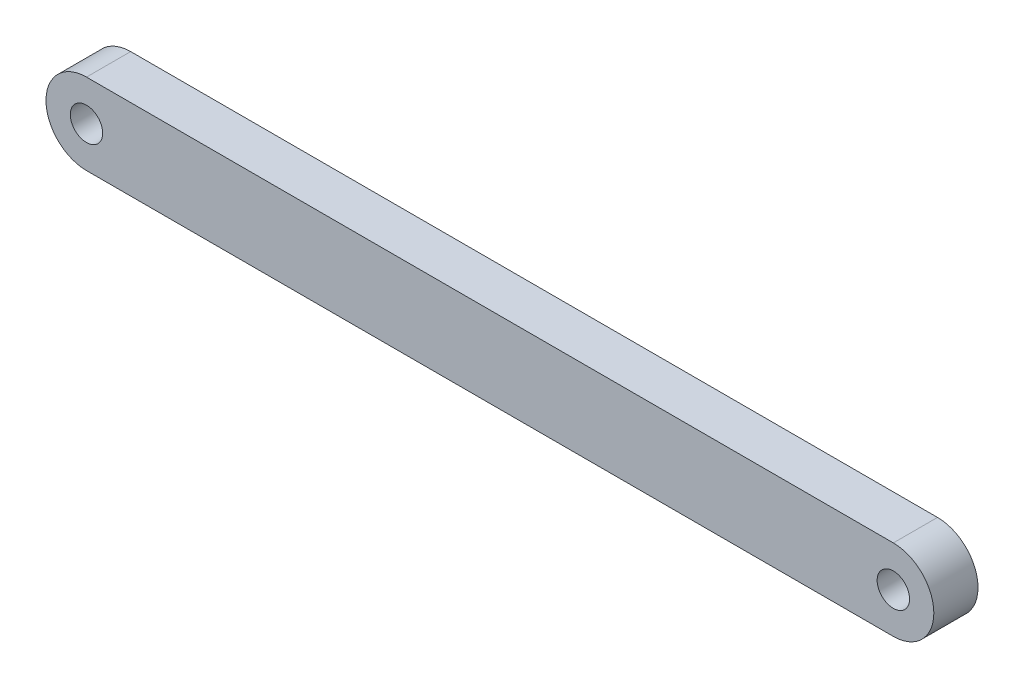
ISO-10303-21;
HEADER;
FILE_DESCRIPTION(('STEP AP214'),'2;1');
FILE_NAME('part.step','',(''),(''),'','','');
FILE_SCHEMA(('AUTOMOTIVE_DESIGN { 1 0 10303 214 1 1 1 1 }'));
ENDSEC;
DATA;
#1=APPLICATION_CONTEXT('core data for automotive mechanical design processes');
#2=APPLICATION_PROTOCOL_DEFINITION('international standard','automotive_design',2000,#1);
#3=PRODUCT_CONTEXT('',#1,'mechanical');
#4=PRODUCT('Part','Part','',(#3));
#5=PRODUCT_RELATED_PRODUCT_CATEGORY('part','',(#4));
#6=PRODUCT_DEFINITION_FORMATION('','',#4);
#7=PRODUCT_DEFINITION_CONTEXT('part definition',#1,'design');
#8=PRODUCT_DEFINITION('design','',#6,#7);
#9=PRODUCT_DEFINITION_SHAPE('','',#8);
#10=(LENGTH_UNIT() NAMED_UNIT(*) SI_UNIT(.MILLI.,.METRE.));
#11=(NAMED_UNIT(*) PLANE_ANGLE_UNIT() SI_UNIT($,.RADIAN.));
#12=(NAMED_UNIT(*) SI_UNIT($,.STERADIAN.) SOLID_ANGLE_UNIT());
#13=UNCERTAINTY_MEASURE_WITH_UNIT(LENGTH_MEASURE(1.E-05),#10,'distance_accuracy_value','');
#14=(GEOMETRIC_REPRESENTATION_CONTEXT(3) GLOBAL_UNCERTAINTY_ASSIGNED_CONTEXT((#13)) GLOBAL_UNIT_ASSIGNED_CONTEXT((#10,
#11,#12)) REPRESENTATION_CONTEXT('',''));
#15=CARTESIAN_POINT('',(0.,0.,0.));
#16=DIRECTION('',(0.,0.,1.));
#17=DIRECTION('',(1.,0.,0.));
#18=AXIS2_PLACEMENT_3D('',#15,#16,#17);
#19=CARTESIAN_POINT('',(-10.9893325627139,0.,3.));
#20=DIRECTION('',(0.,0.,-1.));
#21=DIRECTION('',(-1.,0.,0.));
#22=AXIS2_PLACEMENT_3D('',#19,#20,#21);
#23=CYLINDRICAL_SURFACE('',#22,2.75);
#24=CARTESIAN_POINT('',(-10.9893325627139,0.,0.));
#25=DIRECTION('',(0.,0.,1.));
#26=DIRECTION('',(1.,0.,0.));
#27=AXIS2_PLACEMENT_3D('',#24,#25,#26);
#28=CIRCLE('',#27,2.75);
#29=CARTESIAN_POINT('',(-10.9893325627139,2.75,0.));
#30=VERTEX_POINT('',#29);
#31=CARTESIAN_POINT('',(-10.9893325627139,-2.75,0.));
#32=VERTEX_POINT('',#31);
#33=EDGE_CURVE('E96',#30,#32,#28,.T.);
#34=ORIENTED_EDGE('',*,*,#33,.T.);
#35=DIRECTION('',(0.,0.,-1.));
#36=VECTOR('',#35,1.);
#37=CARTESIAN_POINT('',(-10.9893325627139,-2.75,3.));
#38=LINE('',#37,#36);
#39=CARTESIAN_POINT('',(-10.9893325627139,-2.75,3.));
#40=VERTEX_POINT('',#39);
#41=EDGE_CURVE('E11',#40,#32,#38,.T.);
#42=ORIENTED_EDGE('',*,*,#41,.F.);
#43=CARTESIAN_POINT('',(-10.9893325627139,0.,3.));
#44=DIRECTION('',(0.,0.,1.));
#45=DIRECTION('',(1.,0.,0.));
#46=AXIS2_PLACEMENT_3D('',#43,#44,#45);
#47=CIRCLE('',#46,2.75);
#48=CARTESIAN_POINT('',(-10.9893325627139,2.75,3.));
#49=VERTEX_POINT('',#48);
#50=EDGE_CURVE('E84',#49,#40,#47,.T.);
#51=ORIENTED_EDGE('',*,*,#50,.F.);
#52=DIRECTION('',(0.,0.,-1.));
#53=VECTOR('',#52,1.);
#54=CARTESIAN_POINT('',(-10.9893325627139,2.75,3.));
#55=LINE('',#54,#53);
#56=EDGE_CURVE('E92',#49,#30,#55,.T.);
#57=ORIENTED_EDGE('',*,*,#56,.T.);
#58=EDGE_LOOP('',(#34,#42,#51,#57));
#59=FACE_BOUND('',#58,.T.);
#60=ADVANCED_FACE('F33',(#59),#23,.T.);
#61=CARTESIAN_POINT('',(-10.9893325627139,-2.75,3.));
#62=DIRECTION('',(0.,1.,0.));
#63=DIRECTION('',(-1.,0.,0.));
#64=AXIS2_PLACEMENT_3D('',#61,#62,#63);
#65=PLANE('',#64);
#66=DIRECTION('',(1.,0.,0.));
#67=VECTOR('',#66,1.);
#68=CARTESIAN_POINT('',(-10.9893325627139,-2.75,0.));
#69=LINE('',#68,#67);
#70=CARTESIAN_POINT('',(43.810667437286,-2.75,0.));
#71=VERTEX_POINT('',#70);
#72=EDGE_CURVE('E88',#32,#71,#69,.T.);
#73=ORIENTED_EDGE('',*,*,#72,.T.);
#74=DIRECTION('',(0.,0.,-1.));
#75=VECTOR('',#74,1.);
#76=CARTESIAN_POINT('',(43.810667437286,-2.75,3.));
#77=LINE('',#76,#75);
#78=CARTESIAN_POINT('',(43.810667437286,-2.75,3.));
#79=VERTEX_POINT('',#78);
#80=EDGE_CURVE('E41',#79,#71,#77,.T.);
#81=ORIENTED_EDGE('',*,*,#80,.F.);
#82=DIRECTION('',(1.,0.,0.));
#83=VECTOR('',#82,1.);
#84=CARTESIAN_POINT('',(-10.9893325627139,-2.75,3.));
#85=LINE('',#84,#83);
#86=EDGE_CURVE('E79',#40,#79,#85,.T.);
#87=ORIENTED_EDGE('',*,*,#86,.F.);
#88=ORIENTED_EDGE('',*,*,#41,.T.);
#89=EDGE_LOOP('',(#73,#81,#87,#88));
#90=FACE_BOUND('',#89,.T.);
#91=ADVANCED_FACE('F87',(#90),#65,.F.);
#92=CARTESIAN_POINT('',(43.810667437286,0.,3.));
#93=DIRECTION('',(0.,0.,-1.));
#94=DIRECTION('',(-1.,0.,0.));
#95=AXIS2_PLACEMENT_3D('',#92,#93,#94);
#96=CYLINDRICAL_SURFACE('',#95,2.75);
#97=CARTESIAN_POINT('',(43.810667437286,0.,0.));
#98=DIRECTION('',(0.,0.,1.));
#99=DIRECTION('',(1.,0.,0.));
#100=AXIS2_PLACEMENT_3D('',#97,#98,#99);
#101=CIRCLE('',#100,2.75);
#102=CARTESIAN_POINT('',(43.810667437286,2.75,0.));
#103=VERTEX_POINT('',#102);
#104=EDGE_CURVE('E66',#71,#103,#101,.T.);
#105=ORIENTED_EDGE('',*,*,#104,.T.);
#106=DIRECTION('',(0.,0.,-1.));
#107=VECTOR('',#106,1.);
#108=CARTESIAN_POINT('',(43.810667437286,2.75,3.));
#109=LINE('',#108,#107);
#110=CARTESIAN_POINT('',(43.810667437286,2.75,3.));
#111=VERTEX_POINT('',#110);
#112=EDGE_CURVE('E89',#111,#103,#109,.T.);
#113=ORIENTED_EDGE('',*,*,#112,.F.);
#114=CARTESIAN_POINT('',(43.810667437286,0.,3.));
#115=DIRECTION('',(0.,0.,1.));
#116=DIRECTION('',(1.,0.,0.));
#117=AXIS2_PLACEMENT_3D('',#114,#115,#116);
#118=CIRCLE('',#117,2.75);
#119=EDGE_CURVE('E82',#79,#111,#118,.T.);
#120=ORIENTED_EDGE('',*,*,#119,.F.);
#121=ORIENTED_EDGE('',*,*,#80,.T.);
#122=EDGE_LOOP('',(#105,#113,#120,#121));
#123=FACE_BOUND('',#122,.T.);
#124=ADVANCED_FACE('F90',(#123),#96,.T.);
#125=CARTESIAN_POINT('',(-10.9893325627139,2.75,3.));
#126=DIRECTION('',(0.,-1.,0.));
#127=DIRECTION('',(1.,0.,0.));
#128=AXIS2_PLACEMENT_3D('',#125,#126,#127);
#129=PLANE('',#128);
#130=DIRECTION('',(-1.,0.,0.));
#131=VECTOR('',#130,1.);
#132=CARTESIAN_POINT('',(-10.9893325627139,2.75,0.));
#133=LINE('',#132,#131);
#134=EDGE_CURVE('E72',#103,#30,#133,.T.);
#135=ORIENTED_EDGE('',*,*,#134,.T.);
#136=ORIENTED_EDGE('',*,*,#56,.F.);
#137=DIRECTION('',(-1.,0.,0.));
#138=VECTOR('',#137,1.);
#139=CARTESIAN_POINT('',(-10.9893325627139,2.75,3.));
#140=LINE('',#139,#138);
#141=EDGE_CURVE('E49',#111,#49,#140,.T.);
#142=ORIENTED_EDGE('',*,*,#141,.F.);
#143=ORIENTED_EDGE('',*,*,#112,.T.);
#144=EDGE_LOOP('',(#135,#136,#142,#143));
#145=FACE_BOUND('',#144,.T.);
#146=ADVANCED_FACE('F104',(#145),#129,.F.);
#147=CARTESIAN_POINT('',(-10.9893325627139,0.,3.));
#148=DIRECTION('',(0.,0.,1.));
#149=DIRECTION('',(1.,0.,0.));
#150=AXIS2_PLACEMENT_3D('',#147,#148,#149);
#151=PLANE('',#150);
#152=CARTESIAN_POINT('',(-10.9893325627139,0.,3.));
#153=DIRECTION('',(0.,0.,-1.));
#154=DIRECTION('',(-1.,0.,0.));
#155=AXIS2_PLACEMENT_3D('',#152,#153,#154);
#156=CIRCLE('',#155,1.1);
#157=CARTESIAN_POINT('',(-12.0893325627139,0.,3.));
#158=VERTEX_POINT('',#157);
#159=EDGE_CURVE('E99',#158,#158,#156,.T.);
#160=ORIENTED_EDGE('',*,*,#159,.T.);
#161=EDGE_LOOP('',(#160));
#162=FACE_BOUND('',#161,.T.);
#163=CARTESIAN_POINT('',(43.810667437286,0.,3.));
#164=DIRECTION('',(0.,0.,-1.));
#165=DIRECTION('',(-1.,0.,0.));
#166=AXIS2_PLACEMENT_3D('',#163,#164,#165);
#167=CIRCLE('',#166,1.10000000000001);
#168=CARTESIAN_POINT('',(42.710667437286,0.,3.));
#169=VERTEX_POINT('',#168);
#170=EDGE_CURVE('E113',#169,#169,#167,.T.);
#171=ORIENTED_EDGE('',*,*,#170,.T.);
#172=EDGE_LOOP('',(#171));
#173=FACE_BOUND('',#172,.T.);
#174=ORIENTED_EDGE('',*,*,#50,.T.);
#175=ORIENTED_EDGE('',*,*,#86,.T.);
#176=ORIENTED_EDGE('',*,*,#119,.T.);
#177=ORIENTED_EDGE('',*,*,#141,.T.);
#178=EDGE_LOOP('',(#174,#175,#176,#177));
#179=FACE_BOUND('',#178,.T.);
#180=ADVANCED_FACE('F80',(#162,#173,#179),#151,.T.);
#181=CARTESIAN_POINT('',(-10.9893325627139,0.,0.));
#182=DIRECTION('',(0.,0.,1.));
#183=DIRECTION('',(1.,0.,0.));
#184=AXIS2_PLACEMENT_3D('',#181,#182,#183);
#185=PLANE('',#184);
#186=CARTESIAN_POINT('',(-10.9893325627139,0.,0.));
#187=DIRECTION('',(0.,0.,-1.));
#188=DIRECTION('',(-1.,0.,0.));
#189=AXIS2_PLACEMENT_3D('',#186,#187,#188);
#190=CIRCLE('',#189,1.1);
#191=CARTESIAN_POINT('',(-12.0893325627139,0.,0.));
#192=VERTEX_POINT('',#191);
#193=EDGE_CURVE('E116',#192,#192,#190,.T.);
#194=ORIENTED_EDGE('',*,*,#193,.F.);
#195=EDGE_LOOP('',(#194));
#196=FACE_BOUND('',#195,.T.);
#197=CARTESIAN_POINT('',(43.810667437286,0.,0.));
#198=DIRECTION('',(0.,0.,-1.));
#199=DIRECTION('',(-1.,0.,0.));
#200=AXIS2_PLACEMENT_3D('',#197,#198,#199);
#201=CIRCLE('',#200,1.10000000000001);
#202=CARTESIAN_POINT('',(42.710667437286,0.,0.));
#203=VERTEX_POINT('',#202);
#204=EDGE_CURVE('E110',#203,#203,#201,.T.);
#205=ORIENTED_EDGE('',*,*,#204,.F.);
#206=EDGE_LOOP('',(#205));
#207=FACE_BOUND('',#206,.T.);
#208=ORIENTED_EDGE('',*,*,#33,.F.);
#209=ORIENTED_EDGE('',*,*,#134,.F.);
#210=ORIENTED_EDGE('',*,*,#104,.F.);
#211=ORIENTED_EDGE('',*,*,#72,.F.);
#212=EDGE_LOOP('',(#208,#209,#210,#211));
#213=FACE_BOUND('',#212,.T.);
#214=ADVANCED_FACE('F107',(#196,#207,#213),#185,.F.);
#215=CARTESIAN_POINT('',(43.810667437286,0.,3.));
#216=DIRECTION('',(0.,0.,-1.));
#217=DIRECTION('',(-1.,0.,0.));
#218=AXIS2_PLACEMENT_3D('',#215,#216,#217);
#219=CYLINDRICAL_SURFACE('',#218,1.10000000000001);
#220=ORIENTED_EDGE('',*,*,#170,.F.);
#221=EDGE_LOOP('',(#220));
#222=FACE_BOUND('',#221,.T.);
#223=ORIENTED_EDGE('',*,*,#204,.T.);
#224=EDGE_LOOP('',(#223));
#225=FACE_BOUND('',#224,.T.);
#226=ADVANCED_FACE('F127',(#222,#225),#219,.F.);
#227=CARTESIAN_POINT('',(-10.9893325627139,0.,3.));
#228=DIRECTION('',(0.,0.,-1.));
#229=DIRECTION('',(-1.,0.,0.));
#230=AXIS2_PLACEMENT_3D('',#227,#228,#229);
#231=CYLINDRICAL_SURFACE('',#230,1.1);
#232=ORIENTED_EDGE('',*,*,#159,.F.);
#233=EDGE_LOOP('',(#232));
#234=FACE_BOUND('',#233,.T.);
#235=ORIENTED_EDGE('',*,*,#193,.T.);
#236=EDGE_LOOP('',(#235));
#237=FACE_BOUND('',#236,.T.);
#238=ADVANCED_FACE('F124',(#234,#237),#231,.F.);
#239=CLOSED_SHELL('',(#60,#91,#124,#146,#180,#214,#226,#238));
#240=MANIFOLD_SOLID_BREP('B2',#239);
#241=ADVANCED_BREP_SHAPE_REPRESENTATION('',(#18,#240),#14);
#242=SHAPE_DEFINITION_REPRESENTATION(#9,#241);
ENDSEC;
END-ISO-10303-21;
